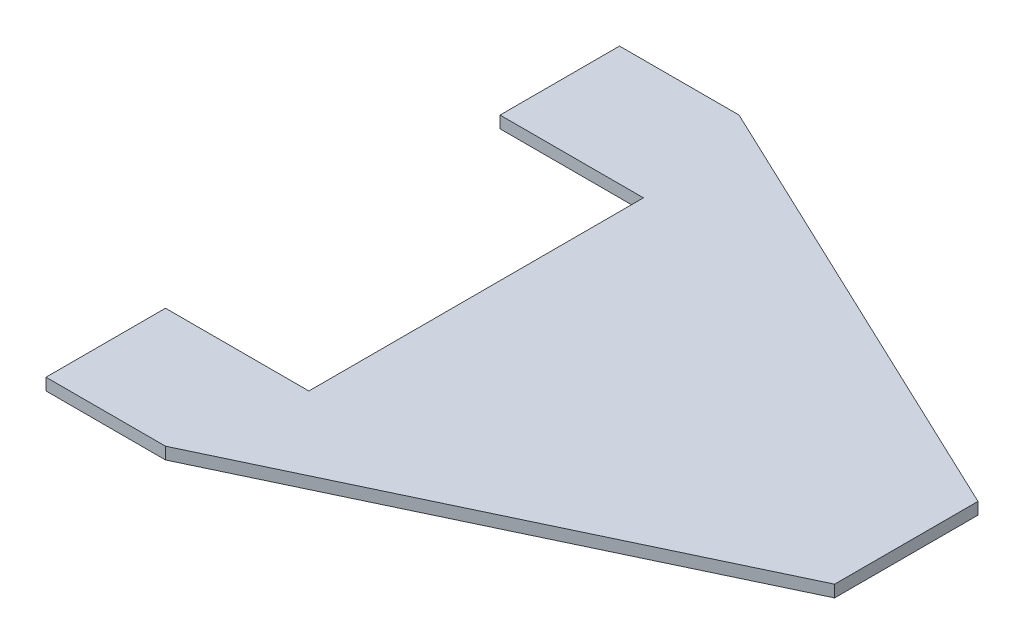
ISO-10303-21;
HEADER;
FILE_DESCRIPTION(('STEP AP214'),'2;1');
FILE_NAME('part.step','',(''),(''),'','','');
FILE_SCHEMA(('AUTOMOTIVE_DESIGN { 1 0 10303 214 1 1 1 1 }'));
ENDSEC;
DATA;
#1=APPLICATION_CONTEXT('core data for automotive mechanical design processes');
#2=APPLICATION_PROTOCOL_DEFINITION('international standard','automotive_design',2000,#1);
#3=PRODUCT_CONTEXT('',#1,'mechanical');
#4=PRODUCT('Part','Part','',(#3));
#5=PRODUCT_RELATED_PRODUCT_CATEGORY('part','',(#4));
#6=PRODUCT_DEFINITION_FORMATION('','',#4);
#7=PRODUCT_DEFINITION_CONTEXT('part definition',#1,'design');
#8=PRODUCT_DEFINITION('design','',#6,#7);
#9=PRODUCT_DEFINITION_SHAPE('','',#8);
#10=(LENGTH_UNIT() NAMED_UNIT(*) SI_UNIT(.MILLI.,.METRE.));
#11=(NAMED_UNIT(*) PLANE_ANGLE_UNIT() SI_UNIT($,.RADIAN.));
#12=(NAMED_UNIT(*) SI_UNIT($,.STERADIAN.) SOLID_ANGLE_UNIT());
#13=UNCERTAINTY_MEASURE_WITH_UNIT(LENGTH_MEASURE(1.E-05),#10,'distance_accuracy_value','');
#14=(GEOMETRIC_REPRESENTATION_CONTEXT(3) GLOBAL_UNCERTAINTY_ASSIGNED_CONTEXT((#13)) GLOBAL_UNIT_ASSIGNED_CONTEXT((#10,
#11,#12)) REPRESENTATION_CONTEXT('',''));
#15=CARTESIAN_POINT('',(0.,0.,0.));
#16=DIRECTION('',(0.,0.,1.));
#17=DIRECTION('',(1.,0.,0.));
#18=AXIS2_PLACEMENT_3D('',#15,#16,#17);
#19=CARTESIAN_POINT('',(0.,6.35,-152.4));
#20=DIRECTION('',(0.,0.,1.));
#21=DIRECTION('',(1.,0.,0.));
#22=AXIS2_PLACEMENT_3D('',#19,#20,#21);
#23=PLANE('',#22);
#24=DIRECTION('',(-1.,0.,0.));
#25=VECTOR('',#24,1.);
#26=CARTESIAN_POINT('',(0.,0.,-152.4));
#27=LINE('',#26,#25);
#28=CARTESIAN_POINT('',(63.5,0.,-152.4));
#29=VERTEX_POINT('',#28);
#30=CARTESIAN_POINT('',(0.,0.,-152.4));
#31=VERTEX_POINT('',#30);
#32=EDGE_CURVE('E141',#29,#31,#27,.T.);
#33=ORIENTED_EDGE('',*,*,#32,.T.);
#34=DIRECTION('',(0.,-1.,0.));
#35=VECTOR('',#34,1.);
#36=CARTESIAN_POINT('',(0.,6.35,-152.4));
#37=LINE('',#36,#35);
#38=CARTESIAN_POINT('',(0.,6.35,-152.4));
#39=VERTEX_POINT('',#38);
#40=EDGE_CURVE('E11',#39,#31,#37,.T.);
#41=ORIENTED_EDGE('',*,*,#40,.F.);
#42=DIRECTION('',(-1.,0.,0.));
#43=VECTOR('',#42,1.);
#44=CARTESIAN_POINT('',(0.,6.35,-152.4));
#45=LINE('',#44,#43);
#46=CARTESIAN_POINT('',(63.5,6.35,-152.4));
#47=VERTEX_POINT('',#46);
#48=EDGE_CURVE('E159',#47,#39,#45,.T.);
#49=ORIENTED_EDGE('',*,*,#48,.F.);
#50=DIRECTION('',(0.,-1.,0.));
#51=VECTOR('',#50,1.);
#52=CARTESIAN_POINT('',(63.5,6.35,-152.4));
#53=LINE('',#52,#51);
#54=EDGE_CURVE('E137',#47,#29,#53,.T.);
#55=ORIENTED_EDGE('',*,*,#54,.T.);
#56=EDGE_LOOP('',(#33,#41,#49,#55));
#57=FACE_BOUND('',#56,.T.);
#58=ADVANCED_FACE('F33',(#57),#23,.F.);
#59=CARTESIAN_POINT('',(0.,6.35,-88.9));
#60=DIRECTION('',(1.,0.,0.));
#61=DIRECTION('',(0.,0.,-1.));
#62=AXIS2_PLACEMENT_3D('',#59,#60,#61);
#63=PLANE('',#62);
#64=DIRECTION('',(0.,0.,1.));
#65=VECTOR('',#64,1.);
#66=CARTESIAN_POINT('',(0.,0.,-88.9));
#67=LINE('',#66,#65);
#68=CARTESIAN_POINT('',(0.,0.,-88.9));
#69=VERTEX_POINT('',#68);
#70=EDGE_CURVE('E144',#31,#69,#67,.T.);
#71=ORIENTED_EDGE('',*,*,#70,.T.);
#72=DIRECTION('',(0.,-1.,0.));
#73=VECTOR('',#72,1.);
#74=CARTESIAN_POINT('',(0.,6.35,-88.9));
#75=LINE('',#74,#73);
#76=CARTESIAN_POINT('',(0.,6.35,-88.9));
#77=VERTEX_POINT('',#76);
#78=EDGE_CURVE('E41',#77,#69,#75,.T.);
#79=ORIENTED_EDGE('',*,*,#78,.F.);
#80=DIRECTION('',(0.,0.,1.));
#81=VECTOR('',#80,1.);
#82=CARTESIAN_POINT('',(0.,6.35,-88.9));
#83=LINE('',#82,#81);
#84=EDGE_CURVE('E98',#39,#77,#83,.T.);
#85=ORIENTED_EDGE('',*,*,#84,.F.);
#86=ORIENTED_EDGE('',*,*,#40,.T.);
#87=EDGE_LOOP('',(#71,#79,#85,#86));
#88=FACE_BOUND('',#87,.T.);
#89=ADVANCED_FACE('F208',(#88),#63,.F.);
#90=CARTESIAN_POINT('',(76.2,6.35,-88.9));
#91=DIRECTION('',(0.,0.,-1.));
#92=DIRECTION('',(-1.,0.,0.));
#93=AXIS2_PLACEMENT_3D('',#90,#91,#92);
#94=PLANE('',#93);
#95=DIRECTION('',(1.,0.,0.));
#96=VECTOR('',#95,1.);
#97=CARTESIAN_POINT('',(76.2,0.,-88.9));
#98=LINE('',#97,#96);
#99=CARTESIAN_POINT('',(76.2,0.,-88.9));
#100=VERTEX_POINT('',#99);
#101=EDGE_CURVE('E146',#69,#100,#98,.T.);
#102=ORIENTED_EDGE('',*,*,#101,.T.);
#103=DIRECTION('',(0.,-1.,0.));
#104=VECTOR('',#103,1.);
#105=CARTESIAN_POINT('',(76.2,6.35,-88.9));
#106=LINE('',#105,#104);
#107=CARTESIAN_POINT('',(76.2,6.35,-88.9));
#108=VERTEX_POINT('',#107);
#109=EDGE_CURVE('E172',#108,#100,#106,.T.);
#110=ORIENTED_EDGE('',*,*,#109,.F.);
#111=DIRECTION('',(1.,0.,0.));
#112=VECTOR('',#111,1.);
#113=CARTESIAN_POINT('',(76.2,6.35,-88.9));
#114=LINE('',#113,#112);
#115=EDGE_CURVE('E180',#77,#108,#114,.T.);
#116=ORIENTED_EDGE('',*,*,#115,.F.);
#117=ORIENTED_EDGE('',*,*,#78,.T.);
#118=EDGE_LOOP('',(#102,#110,#116,#117));
#119=FACE_BOUND('',#118,.T.);
#120=ADVANCED_FACE('F178',(#119),#94,.F.);
#121=CARTESIAN_POINT('',(76.2,6.35,-88.9));
#122=DIRECTION('',(1.,0.,0.));
#123=DIRECTION('',(0.,0.,-1.));
#124=AXIS2_PLACEMENT_3D('',#121,#122,#123);
#125=PLANE('',#124);
#126=DIRECTION('',(0.,0.,1.));
#127=VECTOR('',#126,1.);
#128=CARTESIAN_POINT('',(76.2,0.,-88.9));
#129=LINE('',#128,#127);
#130=CARTESIAN_POINT('',(76.2,0.,88.9));
#131=VERTEX_POINT('',#130);
#132=EDGE_CURVE('E148',#100,#131,#129,.T.);
#133=ORIENTED_EDGE('',*,*,#132,.T.);
#134=DIRECTION('',(0.,-1.,0.));
#135=VECTOR('',#134,1.);
#136=CARTESIAN_POINT('',(76.2,6.35,88.9));
#137=LINE('',#136,#135);
#138=CARTESIAN_POINT('',(76.2,6.35,88.9));
#139=VERTEX_POINT('',#138);
#140=EDGE_CURVE('E169',#139,#131,#137,.T.);
#141=ORIENTED_EDGE('',*,*,#140,.F.);
#142=DIRECTION('',(0.,0.,1.));
#143=VECTOR('',#142,1.);
#144=CARTESIAN_POINT('',(76.2,6.35,-88.9));
#145=LINE('',#144,#143);
#146=EDGE_CURVE('E198',#108,#139,#145,.T.);
#147=ORIENTED_EDGE('',*,*,#146,.F.);
#148=ORIENTED_EDGE('',*,*,#109,.T.);
#149=EDGE_LOOP('',(#133,#141,#147,#148));
#150=FACE_BOUND('',#149,.T.);
#151=ADVANCED_FACE('F189',(#150),#125,.F.);
#152=CARTESIAN_POINT('',(76.2,6.35,88.9));
#153=DIRECTION('',(0.,0.,1.));
#154=DIRECTION('',(1.,0.,0.));
#155=AXIS2_PLACEMENT_3D('',#152,#153,#154);
#156=PLANE('',#155);
#157=DIRECTION('',(-1.,0.,0.));
#158=VECTOR('',#157,1.);
#159=CARTESIAN_POINT('',(76.2,0.,88.9));
#160=LINE('',#159,#158);
#161=CARTESIAN_POINT('',(0.,0.,88.9));
#162=VERTEX_POINT('',#161);
#163=EDGE_CURVE('E150',#131,#162,#160,.T.);
#164=ORIENTED_EDGE('',*,*,#163,.T.);
#165=DIRECTION('',(0.,-1.,0.));
#166=VECTOR('',#165,1.);
#167=CARTESIAN_POINT('',(0.,6.35,88.9));
#168=LINE('',#167,#166);
#169=CARTESIAN_POINT('',(0.,6.35,88.9));
#170=VERTEX_POINT('',#169);
#171=EDGE_CURVE('E166',#170,#162,#168,.T.);
#172=ORIENTED_EDGE('',*,*,#171,.F.);
#173=DIRECTION('',(-1.,0.,0.));
#174=VECTOR('',#173,1.);
#175=CARTESIAN_POINT('',(76.2,6.35,88.9));
#176=LINE('',#175,#174);
#177=EDGE_CURVE('E195',#139,#170,#176,.T.);
#178=ORIENTED_EDGE('',*,*,#177,.F.);
#179=ORIENTED_EDGE('',*,*,#140,.T.);
#180=EDGE_LOOP('',(#164,#172,#178,#179));
#181=FACE_BOUND('',#180,.T.);
#182=ADVANCED_FACE('F193',(#181),#156,.F.);
#183=CARTESIAN_POINT('',(0.,6.35,88.9));
#184=DIRECTION('',(1.,0.,0.));
#185=DIRECTION('',(0.,0.,-1.));
#186=AXIS2_PLACEMENT_3D('',#183,#184,#185);
#187=PLANE('',#186);
#188=DIRECTION('',(0.,0.,1.));
#189=VECTOR('',#188,1.);
#190=CARTESIAN_POINT('',(0.,0.,88.9));
#191=LINE('',#190,#189);
#192=CARTESIAN_POINT('',(0.,0.,152.4));
#193=VERTEX_POINT('',#192);
#194=EDGE_CURVE('E152',#162,#193,#191,.T.);
#195=ORIENTED_EDGE('',*,*,#194,.T.);
#196=DIRECTION('',(0.,-1.,0.));
#197=VECTOR('',#196,1.);
#198=CARTESIAN_POINT('',(0.,6.35,152.4));
#199=LINE('',#198,#197);
#200=CARTESIAN_POINT('',(0.,6.35,152.4));
#201=VERTEX_POINT('',#200);
#202=EDGE_CURVE('E163',#201,#193,#199,.T.);
#203=ORIENTED_EDGE('',*,*,#202,.F.);
#204=DIRECTION('',(0.,0.,1.));
#205=VECTOR('',#204,1.);
#206=CARTESIAN_POINT('',(0.,6.35,88.9));
#207=LINE('',#206,#205);
#208=EDGE_CURVE('E197',#170,#201,#207,.T.);
#209=ORIENTED_EDGE('',*,*,#208,.F.);
#210=ORIENTED_EDGE('',*,*,#171,.T.);
#211=EDGE_LOOP('',(#195,#203,#209,#210));
#212=FACE_BOUND('',#211,.T.);
#213=ADVANCED_FACE('F220',(#212),#187,.F.);
#214=CARTESIAN_POINT('',(0.,6.35,152.4));
#215=DIRECTION('',(0.,0.,-1.));
#216=DIRECTION('',(-1.,0.,0.));
#217=AXIS2_PLACEMENT_3D('',#214,#215,#216);
#218=PLANE('',#217);
#219=DIRECTION('',(1.,0.,0.));
#220=VECTOR('',#219,1.);
#221=CARTESIAN_POINT('',(0.,0.,152.4));
#222=LINE('',#221,#220);
#223=CARTESIAN_POINT('',(63.5,0.,152.4));
#224=VERTEX_POINT('',#223);
#225=EDGE_CURVE('E154',#193,#224,#222,.T.);
#226=ORIENTED_EDGE('',*,*,#225,.T.);
#227=DIRECTION('',(0.,-1.,0.));
#228=VECTOR('',#227,1.);
#229=CARTESIAN_POINT('',(63.5,6.35,152.4));
#230=LINE('',#229,#228);
#231=CARTESIAN_POINT('',(63.5,6.35,152.4));
#232=VERTEX_POINT('',#231);
#233=EDGE_CURVE('E132',#232,#224,#230,.T.);
#234=ORIENTED_EDGE('',*,*,#233,.F.);
#235=DIRECTION('',(1.,0.,0.));
#236=VECTOR('',#235,1.);
#237=CARTESIAN_POINT('',(0.,6.35,152.4));
#238=LINE('',#237,#236);
#239=EDGE_CURVE('E123',#201,#232,#238,.T.);
#240=ORIENTED_EDGE('',*,*,#239,.F.);
#241=ORIENTED_EDGE('',*,*,#202,.T.);
#242=EDGE_LOOP('',(#226,#234,#240,#241));
#243=FACE_BOUND('',#242,.T.);
#244=ADVANCED_FACE('F223',(#243),#218,.F.);
#245=CARTESIAN_POINT('',(63.5,6.35,152.4));
#246=DIRECTION('',(-0.428086344739045,0.,-0.903737838893539));
#247=DIRECTION('',(-0.903737838893539,0.,0.428086344739045));
#248=AXIS2_PLACEMENT_3D('',#245,#246,#247);
#249=PLANE('',#248);
#250=DIRECTION('',(0.903737838893539,0.,-0.428086344739045));
#251=VECTOR('',#250,1.);
#252=CARTESIAN_POINT('',(63.5,0.,152.4));
#253=LINE('',#252,#251);
#254=CARTESIAN_POINT('',(304.8,0.,38.1));
#255=VERTEX_POINT('',#254);
#256=EDGE_CURVE('E131',#224,#255,#253,.T.);
#257=ORIENTED_EDGE('',*,*,#256,.T.);
#258=DIRECTION('',(0.,-1.,0.));
#259=VECTOR('',#258,1.);
#260=CARTESIAN_POINT('',(304.8,6.35,38.1));
#261=LINE('',#260,#259);
#262=CARTESIAN_POINT('',(304.8,6.35,38.1));
#263=VERTEX_POINT('',#262);
#264=EDGE_CURVE('E128',#263,#255,#261,.T.);
#265=ORIENTED_EDGE('',*,*,#264,.F.);
#266=DIRECTION('',(0.903737838893539,0.,-0.428086344739045));
#267=VECTOR('',#266,1.);
#268=CARTESIAN_POINT('',(63.5,6.35,152.4));
#269=LINE('',#268,#267);
#270=EDGE_CURVE('E117',#232,#263,#269,.T.);
#271=ORIENTED_EDGE('',*,*,#270,.F.);
#272=ORIENTED_EDGE('',*,*,#233,.T.);
#273=EDGE_LOOP('',(#257,#265,#271,#272));
#274=FACE_BOUND('',#273,.T.);
#275=ADVANCED_FACE('F129',(#274),#249,.F.);
#276=CARTESIAN_POINT('',(304.8,6.35,38.1));
#277=DIRECTION('',(-1.,0.,0.));
#278=DIRECTION('',(0.,0.,1.));
#279=AXIS2_PLACEMENT_3D('',#276,#277,#278);
#280=PLANE('',#279);
#281=DIRECTION('',(0.,0.,-1.));
#282=VECTOR('',#281,1.);
#283=CARTESIAN_POINT('',(304.8,0.,38.1));
#284=LINE('',#283,#282);
#285=CARTESIAN_POINT('',(304.8,0.,-38.1));
#286=VERTEX_POINT('',#285);
#287=EDGE_CURVE('E84',#255,#286,#284,.T.);
#288=ORIENTED_EDGE('',*,*,#287,.T.);
#289=DIRECTION('',(0.,-1.,0.));
#290=VECTOR('',#289,1.);
#291=CARTESIAN_POINT('',(304.8,6.35,-38.1));
#292=LINE('',#291,#290);
#293=CARTESIAN_POINT('',(304.8,6.35,-38.1));
#294=VERTEX_POINT('',#293);
#295=EDGE_CURVE('E133',#294,#286,#292,.T.);
#296=ORIENTED_EDGE('',*,*,#295,.F.);
#297=DIRECTION('',(0.,0.,-1.));
#298=VECTOR('',#297,1.);
#299=CARTESIAN_POINT('',(304.8,6.35,38.1));
#300=LINE('',#299,#298);
#301=EDGE_CURVE('E121',#263,#294,#300,.T.);
#302=ORIENTED_EDGE('',*,*,#301,.F.);
#303=ORIENTED_EDGE('',*,*,#264,.T.);
#304=EDGE_LOOP('',(#288,#296,#302,#303));
#305=FACE_BOUND('',#304,.T.);
#306=ADVANCED_FACE('F135',(#305),#280,.F.);
#307=CARTESIAN_POINT('',(63.5,6.35,-152.4));
#308=DIRECTION('',(-0.428086344739045,0.,0.903737838893539));
#309=DIRECTION('',(0.903737838893539,0.,0.428086344739045));
#310=AXIS2_PLACEMENT_3D('',#307,#308,#309);
#311=PLANE('',#310);
#312=DIRECTION('',(-0.903737838893539,0.,-0.428086344739045));
#313=VECTOR('',#312,1.);
#314=CARTESIAN_POINT('',(63.5,0.,-152.4));
#315=LINE('',#314,#313);
#316=EDGE_CURVE('E90',#286,#29,#315,.T.);
#317=ORIENTED_EDGE('',*,*,#316,.T.);
#318=ORIENTED_EDGE('',*,*,#54,.F.);
#319=DIRECTION('',(-0.903737838893539,0.,-0.428086344739045));
#320=VECTOR('',#319,1.);
#321=CARTESIAN_POINT('',(63.5,6.35,-152.4));
#322=LINE('',#321,#320);
#323=EDGE_CURVE('E49',#294,#47,#322,.T.);
#324=ORIENTED_EDGE('',*,*,#323,.F.);
#325=ORIENTED_EDGE('',*,*,#295,.T.);
#326=EDGE_LOOP('',(#317,#318,#324,#325));
#327=FACE_BOUND('',#326,.T.);
#328=ADVANCED_FACE('F232',(#327),#311,.F.);
#329=CARTESIAN_POINT('',(0.,6.35,0.));
#330=DIRECTION('',(0.,1.,0.));
#331=DIRECTION('',(0.,0.,1.));
#332=AXIS2_PLACEMENT_3D('',#329,#330,#331);
#333=PLANE('',#332);
#334=ORIENTED_EDGE('',*,*,#48,.T.);
#335=ORIENTED_EDGE('',*,*,#84,.T.);
#336=ORIENTED_EDGE('',*,*,#115,.T.);
#337=ORIENTED_EDGE('',*,*,#146,.T.);
#338=ORIENTED_EDGE('',*,*,#177,.T.);
#339=ORIENTED_EDGE('',*,*,#208,.T.);
#340=ORIENTED_EDGE('',*,*,#239,.T.);
#341=ORIENTED_EDGE('',*,*,#270,.T.);
#342=ORIENTED_EDGE('',*,*,#301,.T.);
#343=ORIENTED_EDGE('',*,*,#323,.T.);
#344=EDGE_LOOP('',(#334,#335,#336,#337,#338,#339,#340,#341,#342,#343));
#345=FACE_BOUND('',#344,.T.);
#346=ADVANCED_FACE('F119',(#345),#333,.T.);
#347=CARTESIAN_POINT('',(0.,0.,0.));
#348=DIRECTION('',(0.,1.,0.));
#349=DIRECTION('',(0.,0.,1.));
#350=AXIS2_PLACEMENT_3D('',#347,#348,#349);
#351=PLANE('',#350);
#352=ORIENTED_EDGE('',*,*,#32,.F.);
#353=ORIENTED_EDGE('',*,*,#316,.F.);
#354=ORIENTED_EDGE('',*,*,#287,.F.);
#355=ORIENTED_EDGE('',*,*,#256,.F.);
#356=ORIENTED_EDGE('',*,*,#225,.F.);
#357=ORIENTED_EDGE('',*,*,#194,.F.);
#358=ORIENTED_EDGE('',*,*,#163,.F.);
#359=ORIENTED_EDGE('',*,*,#132,.F.);
#360=ORIENTED_EDGE('',*,*,#101,.F.);
#361=ORIENTED_EDGE('',*,*,#70,.F.);
#362=EDGE_LOOP('',(#352,#353,#354,#355,#356,#357,#358,#359,#360,#361));
#363=FACE_BOUND('',#362,.T.);
#364=ADVANCED_FACE('F184',(#363),#351,.F.);
#365=CLOSED_SHELL('',(#58,#89,#120,#151,#182,#213,#244,#275,#306,#328,#346,#364));
#366=MANIFOLD_SOLID_BREP('B2',#365);
#367=ADVANCED_BREP_SHAPE_REPRESENTATION('',(#18,#366),#14);
#368=SHAPE_DEFINITION_REPRESENTATION(#9,#367);
ENDSEC;
END-ISO-10303-21;
